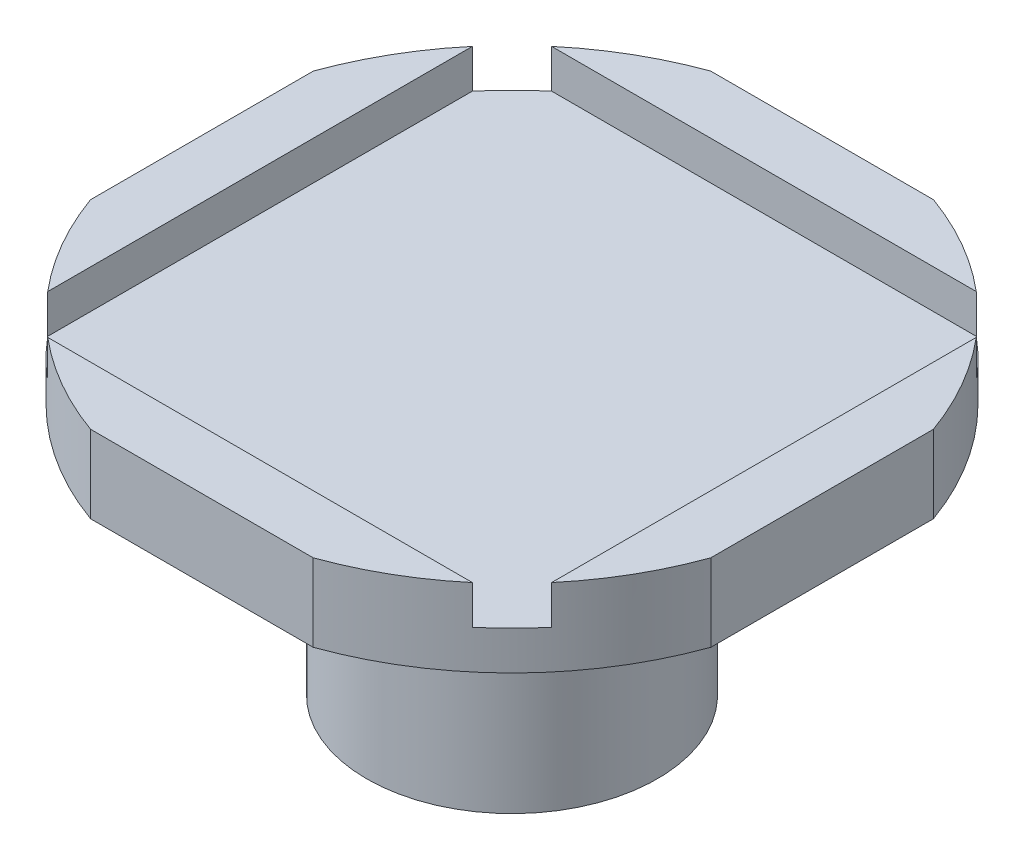
ISO-10303-21;
HEADER;
FILE_DESCRIPTION(('STEP AP214'),'2;1');
FILE_NAME('part.step','',(''),(''),'','','');
FILE_SCHEMA(('AUTOMOTIVE_DESIGN { 1 0 10303 214 1 1 1 1 }'));
ENDSEC;
DATA;
#1=APPLICATION_CONTEXT('core data for automotive mechanical design processes');
#2=APPLICATION_PROTOCOL_DEFINITION('international standard','automotive_design',2000,#1);
#3=PRODUCT_CONTEXT('',#1,'mechanical');
#4=PRODUCT('Part','Part','',(#3));
#5=PRODUCT_RELATED_PRODUCT_CATEGORY('part','',(#4));
#6=PRODUCT_DEFINITION_FORMATION('','',#4);
#7=PRODUCT_DEFINITION_CONTEXT('part definition',#1,'design');
#8=PRODUCT_DEFINITION('design','',#6,#7);
#9=PRODUCT_DEFINITION_SHAPE('','',#8);
#10=(LENGTH_UNIT() NAMED_UNIT(*) SI_UNIT(.MILLI.,.METRE.));
#11=(NAMED_UNIT(*) PLANE_ANGLE_UNIT() SI_UNIT($,.RADIAN.));
#12=(NAMED_UNIT(*) SI_UNIT($,.STERADIAN.) SOLID_ANGLE_UNIT());
#13=UNCERTAINTY_MEASURE_WITH_UNIT(LENGTH_MEASURE(1.E-05),#10,'distance_accuracy_value','');
#14=(GEOMETRIC_REPRESENTATION_CONTEXT(3) GLOBAL_UNCERTAINTY_ASSIGNED_CONTEXT((#13)) GLOBAL_UNIT_ASSIGNED_CONTEXT((#10,
#11,#12)) REPRESENTATION_CONTEXT('',''));
#15=CARTESIAN_POINT('',(0.,0.,0.));
#16=DIRECTION('',(0.,0.,1.));
#17=DIRECTION('',(1.,0.,0.));
#18=AXIS2_PLACEMENT_3D('',#15,#16,#17);
#19=CARTESIAN_POINT('',(0.,3.,16.));
#20=DIRECTION('',(0.,0.,-1.));
#21=DIRECTION('',(-1.,0.,0.));
#22=AXIS2_PLACEMENT_3D('',#19,#20,#21);
#23=PLANE('',#22);
#24=DIRECTION('',(0.,1.,0.));
#25=VECTOR('',#24,1.);
#26=CARTESIAN_POINT('',(-5.74456264653803,-12.,16.));
#27=LINE('',#26,#25);
#28=CARTESIAN_POINT('',(-5.74456264653803,1.,16.));
#29=VERTEX_POINT('',#28);
#30=CARTESIAN_POINT('',(-5.74456264653803,5.,16.));
#31=VERTEX_POINT('',#30);
#32=EDGE_CURVE('E293',#29,#31,#27,.T.);
#33=ORIENTED_EDGE('',*,*,#32,.F.);
#34=DIRECTION('',(1.,0.,0.));
#35=VECTOR('',#34,1.);
#36=CARTESIAN_POINT('',(0.,1.,16.));
#37=LINE('',#36,#35);
#38=CARTESIAN_POINT('',(5.74456264653803,1.,16.));
#39=VERTEX_POINT('',#38);
#40=EDGE_CURVE('E179',#29,#39,#37,.T.);
#41=ORIENTED_EDGE('',*,*,#40,.T.);
#42=DIRECTION('',(0.,1.,0.));
#43=VECTOR('',#42,1.);
#44=CARTESIAN_POINT('',(5.74456264653803,-12.,16.));
#45=LINE('',#44,#43);
#46=CARTESIAN_POINT('',(5.74456264653803,5.,16.));
#47=VERTEX_POINT('',#46);
#48=EDGE_CURVE('E162',#47,#39,#45,.F.);
#49=ORIENTED_EDGE('',*,*,#48,.F.);
#50=DIRECTION('',(1.,0.,0.));
#51=VECTOR('',#50,1.);
#52=CARTESIAN_POINT('',(-16.,5.,16.));
#53=LINE('',#52,#51);
#54=EDGE_CURVE('E177',#31,#47,#53,.T.);
#55=ORIENTED_EDGE('',*,*,#54,.F.);
#56=EDGE_LOOP('',(#33,#41,#49,#55));
#57=FACE_BOUND('',#56,.T.);
#58=ADVANCED_FACE('F47',(#57),#23,.F.);
#59=CARTESIAN_POINT('',(16.,3.,0.));
#60=DIRECTION('',(-1.,0.,0.));
#61=DIRECTION('',(0.,0.,1.));
#62=AXIS2_PLACEMENT_3D('',#59,#60,#61);
#63=PLANE('',#62);
#64=DIRECTION('',(0.,1.,0.));
#65=VECTOR('',#64,1.);
#66=CARTESIAN_POINT('',(16.,-12.,5.74456264653804));
#67=LINE('',#66,#65);
#68=CARTESIAN_POINT('',(16.,1.,5.74456264653804));
#69=VERTEX_POINT('',#68);
#70=CARTESIAN_POINT('',(16.,5.,5.74456264653804));
#71=VERTEX_POINT('',#70);
#72=EDGE_CURVE('E181',#69,#71,#67,.T.);
#73=ORIENTED_EDGE('',*,*,#72,.F.);
#74=DIRECTION('',(0.,0.,-1.));
#75=VECTOR('',#74,1.);
#76=CARTESIAN_POINT('',(16.,1.,0.));
#77=LINE('',#76,#75);
#78=CARTESIAN_POINT('',(16.,1.,-5.74456264653804));
#79=VERTEX_POINT('',#78);
#80=EDGE_CURVE('E187',#69,#79,#77,.T.);
#81=ORIENTED_EDGE('',*,*,#80,.T.);
#82=DIRECTION('',(0.,1.,0.));
#83=VECTOR('',#82,1.);
#84=CARTESIAN_POINT('',(16.,-12.,-5.74456264653804));
#85=LINE('',#84,#83);
#86=CARTESIAN_POINT('',(16.,5.,-5.74456264653804));
#87=VERTEX_POINT('',#86);
#88=EDGE_CURVE('E265',#87,#79,#85,.F.);
#89=ORIENTED_EDGE('',*,*,#88,.F.);
#90=DIRECTION('',(0.,0.,-1.));
#91=VECTOR('',#90,1.);
#92=CARTESIAN_POINT('',(16.,5.,16.));
#93=LINE('',#92,#91);
#94=EDGE_CURVE('E236',#71,#87,#93,.T.);
#95=ORIENTED_EDGE('',*,*,#94,.F.);
#96=EDGE_LOOP('',(#73,#81,#89,#95));
#97=FACE_BOUND('',#96,.T.);
#98=ADVANCED_FACE('F315',(#97),#63,.F.);
#99=CARTESIAN_POINT('',(0.,3.,-16.));
#100=DIRECTION('',(0.,0.,-1.));
#101=DIRECTION('',(-1.,0.,0.));
#102=AXIS2_PLACEMENT_3D('',#99,#100,#101);
#103=PLANE('',#102);
#104=DIRECTION('',(1.,0.,0.));
#105=VECTOR('',#104,1.);
#106=CARTESIAN_POINT('',(0.,1.,-16.));
#107=LINE('',#106,#105);
#108=CARTESIAN_POINT('',(-5.74456264653804,1.,-16.));
#109=VERTEX_POINT('',#108);
#110=CARTESIAN_POINT('',(5.74456264653804,1.,-16.));
#111=VERTEX_POINT('',#110);
#112=EDGE_CURVE('E196',#109,#111,#107,.T.);
#113=ORIENTED_EDGE('',*,*,#112,.F.);
#114=DIRECTION('',(0.,1.,0.));
#115=VECTOR('',#114,1.);
#116=CARTESIAN_POINT('',(-5.74456264653804,-12.,-16.));
#117=LINE('',#116,#115);
#118=CARTESIAN_POINT('',(-5.74456264653804,5.,-16.));
#119=VERTEX_POINT('',#118);
#120=EDGE_CURVE('E253',#109,#119,#117,.T.);
#121=ORIENTED_EDGE('',*,*,#120,.T.);
#122=DIRECTION('',(-1.,0.,0.));
#123=VECTOR('',#122,1.);
#124=CARTESIAN_POINT('',(-16.,5.,-16.));
#125=LINE('',#124,#123);
#126=CARTESIAN_POINT('',(5.74456264653804,5.,-16.));
#127=VERTEX_POINT('',#126);
#128=EDGE_CURVE('E190',#127,#119,#125,.T.);
#129=ORIENTED_EDGE('',*,*,#128,.F.);
#130=DIRECTION('',(0.,1.,0.));
#131=VECTOR('',#130,1.);
#132=CARTESIAN_POINT('',(5.74456264653804,-12.,-16.));
#133=LINE('',#132,#131);
#134=EDGE_CURVE('E252',#127,#111,#133,.F.);
#135=ORIENTED_EDGE('',*,*,#134,.T.);
#136=EDGE_LOOP('',(#113,#121,#129,#135));
#137=FACE_BOUND('',#136,.T.);
#138=ADVANCED_FACE('F251',(#137),#103,.T.);
#139=CARTESIAN_POINT('',(-16.,3.,0.));
#140=DIRECTION('',(-1.,0.,0.));
#141=DIRECTION('',(0.,0.,1.));
#142=AXIS2_PLACEMENT_3D('',#139,#140,#141);
#143=PLANE('',#142);
#144=DIRECTION('',(0.,0.,-1.));
#145=VECTOR('',#144,1.);
#146=CARTESIAN_POINT('',(-16.,1.,0.));
#147=LINE('',#146,#145);
#148=CARTESIAN_POINT('',(-16.,1.,5.74456264653801));
#149=VERTEX_POINT('',#148);
#150=CARTESIAN_POINT('',(-16.,1.,-5.74456264653801));
#151=VERTEX_POINT('',#150);
#152=EDGE_CURVE('E198',#149,#151,#147,.T.);
#153=ORIENTED_EDGE('',*,*,#152,.F.);
#154=DIRECTION('',(0.,1.,0.));
#155=VECTOR('',#154,1.);
#156=CARTESIAN_POINT('',(-16.,-12.,5.74456264653801));
#157=LINE('',#156,#155);
#158=CARTESIAN_POINT('',(-16.,5.,5.74456264653804));
#159=VERTEX_POINT('',#158);
#160=EDGE_CURVE('E291',#149,#159,#157,.T.);
#161=ORIENTED_EDGE('',*,*,#160,.T.);
#162=DIRECTION('',(0.,0.,1.));
#163=VECTOR('',#162,1.);
#164=CARTESIAN_POINT('',(-16.,5.,16.));
#165=LINE('',#164,#163);
#166=CARTESIAN_POINT('',(-16.,5.,-5.74456264653804));
#167=VERTEX_POINT('',#166);
#168=EDGE_CURVE('E185',#167,#159,#165,.T.);
#169=ORIENTED_EDGE('',*,*,#168,.F.);
#170=DIRECTION('',(0.,1.,0.));
#171=VECTOR('',#170,1.);
#172=CARTESIAN_POINT('',(-16.,-12.,-5.74456264653801));
#173=LINE('',#172,#171);
#174=EDGE_CURVE('E255',#167,#151,#173,.F.);
#175=ORIENTED_EDGE('',*,*,#174,.T.);
#176=EDGE_LOOP('',(#153,#161,#169,#175));
#177=FACE_BOUND('',#176,.T.);
#178=ADVANCED_FACE('F298',(#177),#143,.T.);
#179=CARTESIAN_POINT('',(0.,1.,0.));
#180=DIRECTION('',(0.,1.,0.));
#181=DIRECTION('',(0.,0.,1.));
#182=AXIS2_PLACEMENT_3D('',#179,#180,#181);
#183=PLANE('',#182);
#184=CARTESIAN_POINT('',(0.,1.,0.));
#185=DIRECTION('',(0.,1.,0.));
#186=DIRECTION('',(0.,0.,1.));
#187=AXIS2_PLACEMENT_3D('',#184,#185,#186);
#188=CIRCLE('',#187,17.);
#189=EDGE_CURVE('E259',#39,#69,#188,.T.);
#190=ORIENTED_EDGE('',*,*,#189,.F.);
#191=ORIENTED_EDGE('',*,*,#40,.F.);
#192=EDGE_CURVE('E289',#149,#29,#188,.T.);
#193=ORIENTED_EDGE('',*,*,#192,.F.);
#194=ORIENTED_EDGE('',*,*,#152,.T.);
#195=EDGE_CURVE('E258',#109,#151,#188,.T.);
#196=ORIENTED_EDGE('',*,*,#195,.F.);
#197=ORIENTED_EDGE('',*,*,#112,.T.);
#198=EDGE_CURVE('E254',#79,#111,#188,.T.);
#199=ORIENTED_EDGE('',*,*,#198,.F.);
#200=ORIENTED_EDGE('',*,*,#80,.F.);
#201=EDGE_LOOP('',(#190,#191,#193,#194,#196,#197,#199,#200));
#202=FACE_BOUND('',#201,.T.);
#203=ADVANCED_FACE('F319',(#202),#183,.F.);
#204=CARTESIAN_POINT('',(0.,5.,0.));
#205=DIRECTION('',(0.,-1.,0.));
#206=DIRECTION('',(0.,0.,-1.));
#207=AXIS2_PLACEMENT_3D('',#204,#205,#206);
#208=PLANE('',#207);
#209=CARTESIAN_POINT('',(0.,5.,0.));
#210=DIRECTION('',(0.,1.,0.));
#211=DIRECTION('',(0.,0.,1.));
#212=AXIS2_PLACEMENT_3D('',#209,#210,#211);
#213=CIRCLE('',#212,17.);
#214=CARTESIAN_POINT('',(10.9544511501033,5.,-13.));
#215=VERTEX_POINT('',#214);
#216=EDGE_CURVE('E246',#215,#127,#213,.T.);
#217=ORIENTED_EDGE('',*,*,#216,.T.);
#218=ORIENTED_EDGE('',*,*,#128,.T.);
#219=CARTESIAN_POINT('',(-10.9544511501033,5.,-13.));
#220=VERTEX_POINT('',#219);
#221=EDGE_CURVE('E245',#119,#220,#213,.T.);
#222=ORIENTED_EDGE('',*,*,#221,.T.);
#223=DIRECTION('',(-1.,0.,0.));
#224=VECTOR('',#223,1.);
#225=CARTESIAN_POINT('',(-13.,5.,-13.));
#226=LINE('',#225,#224);
#227=EDGE_CURVE('E270',#215,#220,#226,.T.);
#228=ORIENTED_EDGE('',*,*,#227,.F.);
#229=EDGE_LOOP('',(#217,#218,#222,#228));
#230=FACE_BOUND('',#229,.T.);
#231=ADVANCED_FACE('F244',(#230),#208,.F.);
#232=CARTESIAN_POINT('',(13.,5.,-10.9544511501033));
#233=VERTEX_POINT('',#232);
#234=EDGE_CURVE('E305',#87,#233,#213,.T.);
#235=ORIENTED_EDGE('',*,*,#234,.T.);
#236=DIRECTION('',(0.,0.,-1.));
#237=VECTOR('',#236,1.);
#238=CARTESIAN_POINT('',(13.,5.,13.));
#239=LINE('',#238,#237);
#240=CARTESIAN_POINT('',(13.,5.,10.9544511501033));
#241=VERTEX_POINT('',#240);
#242=EDGE_CURVE('E235',#241,#233,#239,.T.);
#243=ORIENTED_EDGE('',*,*,#242,.F.);
#244=EDGE_CURVE('E170',#241,#71,#213,.T.);
#245=ORIENTED_EDGE('',*,*,#244,.T.);
#246=ORIENTED_EDGE('',*,*,#94,.T.);
#247=EDGE_LOOP('',(#235,#243,#245,#246));
#248=FACE_BOUND('',#247,.T.);
#249=ADVANCED_FACE('F311',(#248),#208,.F.);
#250=CARTESIAN_POINT('',(10.9544511501033,5.,13.));
#251=VERTEX_POINT('',#250);
#252=EDGE_CURVE('E159',#47,#251,#213,.T.);
#253=ORIENTED_EDGE('',*,*,#252,.T.);
#254=DIRECTION('',(1.,0.,0.));
#255=VECTOR('',#254,1.);
#256=CARTESIAN_POINT('',(-13.,5.,13.));
#257=LINE('',#256,#255);
#258=CARTESIAN_POINT('',(-10.9544511501033,5.,13.));
#259=VERTEX_POINT('',#258);
#260=EDGE_CURVE('E238',#259,#251,#257,.T.);
#261=ORIENTED_EDGE('',*,*,#260,.F.);
#262=EDGE_CURVE('E172',#259,#31,#213,.T.);
#263=ORIENTED_EDGE('',*,*,#262,.T.);
#264=ORIENTED_EDGE('',*,*,#54,.T.);
#265=EDGE_LOOP('',(#253,#261,#263,#264));
#266=FACE_BOUND('',#265,.T.);
#267=ADVANCED_FACE('F184',(#266),#208,.F.);
#268=CARTESIAN_POINT('',(-13.,5.,10.9544511501033));
#269=VERTEX_POINT('',#268);
#270=EDGE_CURVE('E303',#159,#269,#213,.T.);
#271=ORIENTED_EDGE('',*,*,#270,.T.);
#272=DIRECTION('',(0.,0.,1.));
#273=VECTOR('',#272,1.);
#274=CARTESIAN_POINT('',(-13.,5.,13.));
#275=LINE('',#274,#273);
#276=CARTESIAN_POINT('',(-13.,5.,-10.9544511501033));
#277=VERTEX_POINT('',#276);
#278=EDGE_CURVE('E272',#277,#269,#275,.T.);
#279=ORIENTED_EDGE('',*,*,#278,.F.);
#280=EDGE_CURVE('E304',#277,#167,#213,.T.);
#281=ORIENTED_EDGE('',*,*,#280,.T.);
#282=ORIENTED_EDGE('',*,*,#168,.T.);
#283=EDGE_LOOP('',(#271,#279,#281,#282));
#284=FACE_BOUND('',#283,.T.);
#285=ADVANCED_FACE('F301',(#284),#208,.F.);
#286=CARTESIAN_POINT('',(13.,5.,13.));
#287=DIRECTION('',(-1.,0.,0.));
#288=DIRECTION('',(0.,0.,1.));
#289=AXIS2_PLACEMENT_3D('',#286,#287,#288);
#290=PLANE('',#289);
#291=DIRECTION('',(0.,0.,-1.));
#292=VECTOR('',#291,1.);
#293=CARTESIAN_POINT('',(13.,3.,13.));
#294=LINE('',#293,#292);
#295=CARTESIAN_POINT('',(13.,3.,10.9544511501033));
#296=VERTEX_POINT('',#295);
#297=CARTESIAN_POINT('',(13.,3.,-10.9544511501033));
#298=VERTEX_POINT('',#297);
#299=EDGE_CURVE('E180',#296,#298,#294,.T.);
#300=ORIENTED_EDGE('',*,*,#299,.F.);
#301=DIRECTION('',(0.,1.,0.));
#302=VECTOR('',#301,1.);
#303=CARTESIAN_POINT('',(13.,-12.,10.9544511501033));
#304=LINE('',#303,#302);
#305=EDGE_CURVE('E287',#296,#241,#304,.T.);
#306=ORIENTED_EDGE('',*,*,#305,.T.);
#307=ORIENTED_EDGE('',*,*,#242,.T.);
#308=DIRECTION('',(0.,1.,0.));
#309=VECTOR('',#308,1.);
#310=CARTESIAN_POINT('',(13.,-12.,-10.9544511501033));
#311=LINE('',#310,#309);
#312=EDGE_CURVE('E284',#233,#298,#311,.F.);
#313=ORIENTED_EDGE('',*,*,#312,.T.);
#314=EDGE_LOOP('',(#300,#306,#307,#313));
#315=FACE_BOUND('',#314,.T.);
#316=ADVANCED_FACE('F330',(#315),#290,.T.);
#317=CARTESIAN_POINT('',(-13.,5.,-13.));
#318=DIRECTION('',(0.,0.,1.));
#319=DIRECTION('',(1.,0.,0.));
#320=AXIS2_PLACEMENT_3D('',#317,#318,#319);
#321=PLANE('',#320);
#322=DIRECTION('',(-1.,0.,0.));
#323=VECTOR('',#322,1.);
#324=CARTESIAN_POINT('',(-13.,3.,-13.));
#325=LINE('',#324,#323);
#326=CARTESIAN_POINT('',(10.9544511501033,3.,-13.));
#327=VERTEX_POINT('',#326);
#328=CARTESIAN_POINT('',(-10.9544511501033,3.,-13.));
#329=VERTEX_POINT('',#328);
#330=EDGE_CURVE('E215',#327,#329,#325,.T.);
#331=ORIENTED_EDGE('',*,*,#330,.F.);
#332=DIRECTION('',(0.,1.,0.));
#333=VECTOR('',#332,1.);
#334=CARTESIAN_POINT('',(10.9544511501033,-12.,-13.));
#335=LINE('',#334,#333);
#336=EDGE_CURVE('E224',#327,#215,#335,.T.);
#337=ORIENTED_EDGE('',*,*,#336,.T.);
#338=ORIENTED_EDGE('',*,*,#227,.T.);
#339=DIRECTION('',(0.,1.,0.));
#340=VECTOR('',#339,1.);
#341=CARTESIAN_POINT('',(-10.9544511501033,-12.,-13.));
#342=LINE('',#341,#340);
#343=EDGE_CURVE('E226',#220,#329,#342,.F.);
#344=ORIENTED_EDGE('',*,*,#343,.T.);
#345=EDGE_LOOP('',(#331,#337,#338,#344));
#346=FACE_BOUND('',#345,.T.);
#347=ADVANCED_FACE('F222',(#346),#321,.T.);
#348=CARTESIAN_POINT('',(-13.,5.,13.));
#349=DIRECTION('',(1.,0.,0.));
#350=DIRECTION('',(0.,0.,-1.));
#351=AXIS2_PLACEMENT_3D('',#348,#349,#350);
#352=PLANE('',#351);
#353=DIRECTION('',(0.,0.,1.));
#354=VECTOR('',#353,1.);
#355=CARTESIAN_POINT('',(-13.,3.,13.));
#356=LINE('',#355,#354);
#357=CARTESIAN_POINT('',(-13.,3.,-10.9544511501033));
#358=VERTEX_POINT('',#357);
#359=CARTESIAN_POINT('',(-13.,3.,10.9544511501033));
#360=VERTEX_POINT('',#359);
#361=EDGE_CURVE('E227',#358,#360,#356,.T.);
#362=ORIENTED_EDGE('',*,*,#361,.F.);
#363=DIRECTION('',(0.,1.,0.));
#364=VECTOR('',#363,1.);
#365=CARTESIAN_POINT('',(-13.,-12.,-10.9544511501033));
#366=LINE('',#365,#364);
#367=EDGE_CURVE('E70',#358,#277,#366,.T.);
#368=ORIENTED_EDGE('',*,*,#367,.T.);
#369=ORIENTED_EDGE('',*,*,#278,.T.);
#370=DIRECTION('',(0.,1.,0.));
#371=VECTOR('',#370,1.);
#372=CARTESIAN_POINT('',(-13.,-12.,10.9544511501033));
#373=LINE('',#372,#371);
#374=EDGE_CURVE('E276',#269,#360,#373,.F.);
#375=ORIENTED_EDGE('',*,*,#374,.T.);
#376=EDGE_LOOP('',(#362,#368,#369,#375));
#377=FACE_BOUND('',#376,.T.);
#378=ADVANCED_FACE('F322',(#377),#352,.T.);
#379=CARTESIAN_POINT('',(-13.,5.,13.));
#380=DIRECTION('',(0.,0.,-1.));
#381=DIRECTION('',(-1.,0.,0.));
#382=AXIS2_PLACEMENT_3D('',#379,#380,#381);
#383=PLANE('',#382);
#384=DIRECTION('',(1.,0.,0.));
#385=VECTOR('',#384,1.);
#386=CARTESIAN_POINT('',(-13.,3.,13.));
#387=LINE('',#386,#385);
#388=CARTESIAN_POINT('',(-10.9544511501033,3.,13.));
#389=VERTEX_POINT('',#388);
#390=CARTESIAN_POINT('',(10.9544511501033,3.,13.));
#391=VERTEX_POINT('',#390);
#392=EDGE_CURVE('E229',#389,#391,#387,.T.);
#393=ORIENTED_EDGE('',*,*,#392,.F.);
#394=DIRECTION('',(0.,1.,0.));
#395=VECTOR('',#394,1.);
#396=CARTESIAN_POINT('',(-10.9544511501033,-12.,13.));
#397=LINE('',#396,#395);
#398=EDGE_CURVE('E62',#389,#259,#397,.T.);
#399=ORIENTED_EDGE('',*,*,#398,.T.);
#400=ORIENTED_EDGE('',*,*,#260,.T.);
#401=DIRECTION('',(0.,1.,0.));
#402=VECTOR('',#401,1.);
#403=CARTESIAN_POINT('',(10.9544511501033,-12.,13.));
#404=LINE('',#403,#402);
#405=EDGE_CURVE('E165',#251,#391,#404,.F.);
#406=ORIENTED_EDGE('',*,*,#405,.T.);
#407=EDGE_LOOP('',(#393,#399,#400,#406));
#408=FACE_BOUND('',#407,.T.);
#409=ADVANCED_FACE('F275',(#408),#383,.T.);
#410=CARTESIAN_POINT('',(0.,3.,0.));
#411=DIRECTION('',(0.,1.,0.));
#412=DIRECTION('',(0.,0.,1.));
#413=AXIS2_PLACEMENT_3D('',#410,#411,#412);
#414=PLANE('',#413);
#415=ORIENTED_EDGE('',*,*,#392,.T.);
#416=CARTESIAN_POINT('',(0.,3.,0.));
#417=DIRECTION('',(0.,1.,0.));
#418=DIRECTION('',(0.,0.,1.));
#419=AXIS2_PLACEMENT_3D('',#416,#417,#418);
#420=CIRCLE('',#419,17.);
#421=EDGE_CURVE('E12',#391,#296,#420,.T.);
#422=ORIENTED_EDGE('',*,*,#421,.T.);
#423=ORIENTED_EDGE('',*,*,#299,.T.);
#424=EDGE_CURVE('E55',#298,#327,#420,.T.);
#425=ORIENTED_EDGE('',*,*,#424,.T.);
#426=ORIENTED_EDGE('',*,*,#330,.T.);
#427=EDGE_CURVE('E204',#329,#358,#420,.T.);
#428=ORIENTED_EDGE('',*,*,#427,.T.);
#429=ORIENTED_EDGE('',*,*,#361,.T.);
#430=EDGE_CURVE('E50',#360,#389,#420,.T.);
#431=ORIENTED_EDGE('',*,*,#430,.T.);
#432=EDGE_LOOP('',(#415,#422,#423,#425,#426,#428,#429,#431));
#433=FACE_BOUND('',#432,.T.);
#434=ADVANCED_FACE('F214',(#433),#414,.T.);
#435=CARTESIAN_POINT('',(0.,-12.,0.));
#436=DIRECTION('',(0.,1.,0.));
#437=DIRECTION('',(0.,0.,1.));
#438=AXIS2_PLACEMENT_3D('',#435,#436,#437);
#439=CYLINDRICAL_SURFACE('',#438,17.);
#440=ORIENTED_EDGE('',*,*,#32,.T.);
#441=ORIENTED_EDGE('',*,*,#262,.F.);
#442=ORIENTED_EDGE('',*,*,#398,.F.);
#443=ORIENTED_EDGE('',*,*,#430,.F.);
#444=ORIENTED_EDGE('',*,*,#374,.F.);
#445=ORIENTED_EDGE('',*,*,#270,.F.);
#446=ORIENTED_EDGE('',*,*,#160,.F.);
#447=ORIENTED_EDGE('',*,*,#192,.T.);
#448=EDGE_LOOP('',(#440,#441,#442,#443,#444,#445,#446,#447));
#449=FACE_BOUND('',#448,.T.);
#450=ADVANCED_FACE('F320',(#449),#439,.T.);
#451=ORIENTED_EDGE('',*,*,#195,.T.);
#452=ORIENTED_EDGE('',*,*,#174,.F.);
#453=ORIENTED_EDGE('',*,*,#280,.F.);
#454=ORIENTED_EDGE('',*,*,#367,.F.);
#455=ORIENTED_EDGE('',*,*,#427,.F.);
#456=ORIENTED_EDGE('',*,*,#343,.F.);
#457=ORIENTED_EDGE('',*,*,#221,.F.);
#458=ORIENTED_EDGE('',*,*,#120,.F.);
#459=EDGE_LOOP('',(#451,#452,#453,#454,#455,#456,#457,#458));
#460=FACE_BOUND('',#459,.T.);
#461=ADVANCED_FACE('F294',(#460),#439,.T.);
#462=ORIENTED_EDGE('',*,*,#88,.T.);
#463=ORIENTED_EDGE('',*,*,#198,.T.);
#464=ORIENTED_EDGE('',*,*,#134,.F.);
#465=ORIENTED_EDGE('',*,*,#216,.F.);
#466=ORIENTED_EDGE('',*,*,#336,.F.);
#467=ORIENTED_EDGE('',*,*,#424,.F.);
#468=ORIENTED_EDGE('',*,*,#312,.F.);
#469=ORIENTED_EDGE('',*,*,#234,.F.);
#470=EDGE_LOOP('',(#462,#463,#464,#465,#466,#467,#468,#469));
#471=FACE_BOUND('',#470,.T.);
#472=ADVANCED_FACE('F318',(#471),#439,.T.);
#473=ORIENTED_EDGE('',*,*,#48,.T.);
#474=ORIENTED_EDGE('',*,*,#189,.T.);
#475=ORIENTED_EDGE('',*,*,#72,.T.);
#476=ORIENTED_EDGE('',*,*,#244,.F.);
#477=ORIENTED_EDGE('',*,*,#305,.F.);
#478=ORIENTED_EDGE('',*,*,#421,.F.);
#479=ORIENTED_EDGE('',*,*,#405,.F.);
#480=ORIENTED_EDGE('',*,*,#252,.F.);
#481=EDGE_LOOP('',(#473,#474,#475,#476,#477,#478,#479,#480));
#482=FACE_BOUND('',#481,.T.);
#483=ADVANCED_FACE('F161',(#482),#439,.T.);
#484=CLOSED_SHELL('',(#58,#98,#138,#178,#203,#231,#249,#267,#285,#316,#347,#378,#409,#434,#450,
#461,#472,#483));
#485=MANIFOLD_SOLID_BREP('B2',#484);
#486=CARTESIAN_POINT('',(0.,-12.,0.));
#487=DIRECTION('',(0.,1.,0.));
#488=DIRECTION('',(0.,0.,1.));
#489=AXIS2_PLACEMENT_3D('',#486,#487,#488);
#490=CYLINDRICAL_SURFACE('',#489,7.5);
#491=CARTESIAN_POINT('',(0.,-12.,0.));
#492=DIRECTION('',(0.,1.,0.));
#493=DIRECTION('',(0.,0.,1.));
#494=AXIS2_PLACEMENT_3D('',#491,#492,#493);
#495=CIRCLE('',#494,7.5);
#496=CARTESIAN_POINT('',(0.,-12.,7.5));
#497=VERTEX_POINT('',#496);
#498=EDGE_CURVE('E46',#497,#497,#495,.T.);
#499=ORIENTED_EDGE('',*,*,#498,.T.);
#500=EDGE_LOOP('',(#499));
#501=FACE_BOUND('',#500,.T.);
#502=CARTESIAN_POINT('',(0.,0.,0.));
#503=DIRECTION('',(0.,1.,0.));
#504=DIRECTION('',(0.,0.,1.));
#505=AXIS2_PLACEMENT_3D('',#502,#503,#504);
#506=CIRCLE('',#505,7.5);
#507=CARTESIAN_POINT('',(0.,0.,7.5));
#508=VERTEX_POINT('',#507);
#509=EDGE_CURVE('E479',#508,#508,#506,.T.);
#510=ORIENTED_EDGE('',*,*,#509,.F.);
#511=EDGE_LOOP('',(#510));
#512=FACE_BOUND('',#511,.T.);
#513=ADVANCED_FACE('F476',(#501,#512),#490,.T.);
#514=CARTESIAN_POINT('',(0.,-12.,0.));
#515=DIRECTION('',(0.,1.,0.));
#516=DIRECTION('',(0.,0.,1.));
#517=AXIS2_PLACEMENT_3D('',#514,#515,#516);
#518=PLANE('',#517);
#519=ORIENTED_EDGE('',*,*,#498,.F.);
#520=EDGE_LOOP('',(#519));
#521=FACE_BOUND('',#520,.T.);
#522=ADVANCED_FACE('F499',(#521),#518,.F.);
#523=CARTESIAN_POINT('',(0.,1.,0.));
#524=DIRECTION('',(0.,-1.,0.));
#525=DIRECTION('',(0.,0.,-1.));
#526=AXIS2_PLACEMENT_3D('',#523,#524,#525);
#527=CYLINDRICAL_SURFACE('',#526,8.5);
#528=CARTESIAN_POINT('',(0.,1.,0.));
#529=DIRECTION('',(0.,1.,0.));
#530=DIRECTION('',(0.,0.,1.));
#531=AXIS2_PLACEMENT_3D('',#528,#529,#530);
#532=CIRCLE('',#531,8.5);
#533=CARTESIAN_POINT('',(0.,1.,8.5));
#534=VERTEX_POINT('',#533);
#535=EDGE_CURVE('E486',#534,#534,#532,.T.);
#536=ORIENTED_EDGE('',*,*,#535,.F.);
#537=EDGE_LOOP('',(#536));
#538=FACE_BOUND('',#537,.T.);
#539=CARTESIAN_POINT('',(0.,0.,0.));
#540=DIRECTION('',(0.,1.,0.));
#541=DIRECTION('',(0.,0.,1.));
#542=AXIS2_PLACEMENT_3D('',#539,#540,#541);
#543=CIRCLE('',#542,8.5);
#544=CARTESIAN_POINT('',(0.,0.,8.5));
#545=VERTEX_POINT('',#544);
#546=EDGE_CURVE('E488',#545,#545,#543,.T.);
#547=ORIENTED_EDGE('',*,*,#546,.T.);
#548=EDGE_LOOP('',(#547));
#549=FACE_BOUND('',#548,.T.);
#550=ADVANCED_FACE('F496',(#538,#549),#527,.T.);
#551=CARTESIAN_POINT('',(0.,1.,0.));
#552=DIRECTION('',(0.,1.,0.));
#553=DIRECTION('',(0.,0.,1.));
#554=AXIS2_PLACEMENT_3D('',#551,#552,#553);
#555=PLANE('',#554);
#556=ORIENTED_EDGE('',*,*,#535,.T.);
#557=EDGE_LOOP('',(#556));
#558=FACE_BOUND('',#557,.T.);
#559=ADVANCED_FACE('F494',(#558),#555,.T.);
#560=CARTESIAN_POINT('',(0.,0.,0.));
#561=DIRECTION('',(0.,1.,0.));
#562=DIRECTION('',(0.,0.,1.));
#563=AXIS2_PLACEMENT_3D('',#560,#561,#562);
#564=PLANE('',#563);
#565=ORIENTED_EDGE('',*,*,#509,.T.);
#566=EDGE_LOOP('',(#565));
#567=FACE_BOUND('',#566,.T.);
#568=ORIENTED_EDGE('',*,*,#546,.F.);
#569=EDGE_LOOP('',(#568));
#570=FACE_BOUND('',#569,.T.);
#571=ADVANCED_FACE('F503',(#567,#570),#564,.F.);
#572=CLOSED_SHELL('',(#513,#522,#550,#559,#571));
#573=MANIFOLD_SOLID_BREP('B6',#572);
#574=ADVANCED_BREP_SHAPE_REPRESENTATION('',(#18,#485,#573),#14);
#575=SHAPE_DEFINITION_REPRESENTATION(#9,#574);
ENDSEC;
END-ISO-10303-21;
